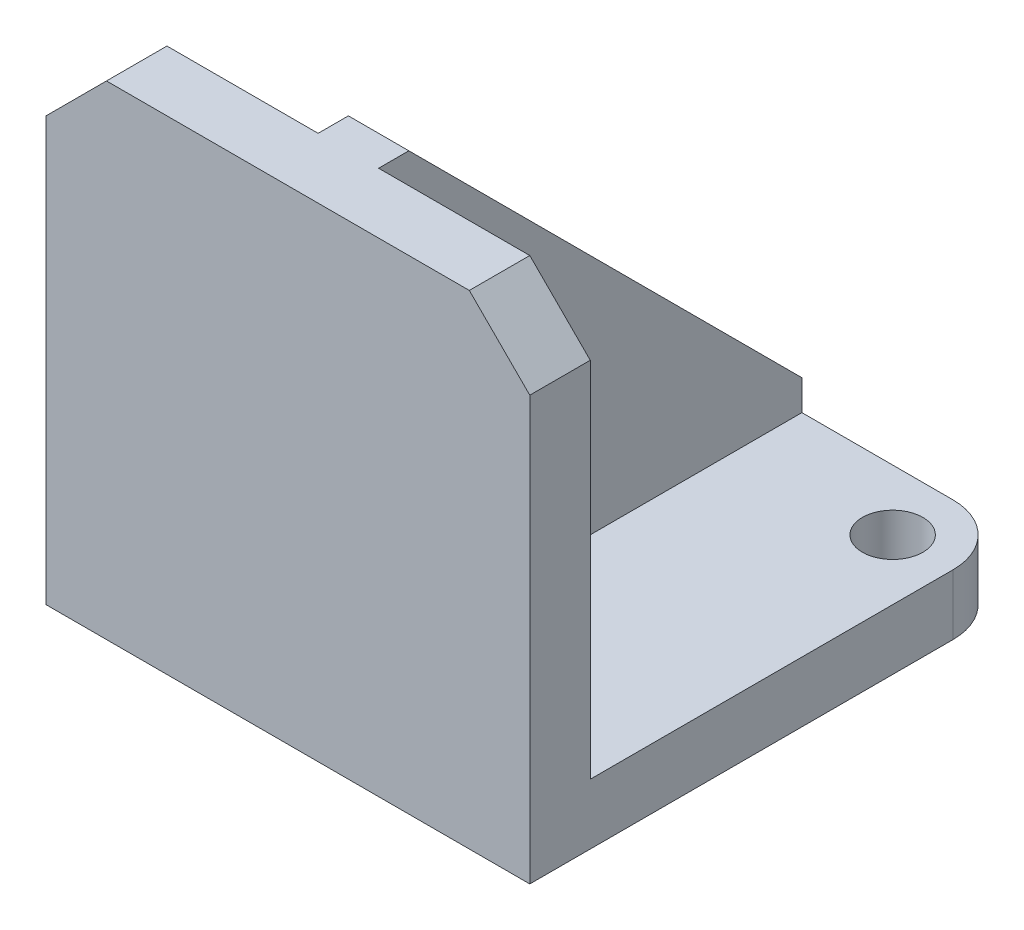
ISO-10303-21;
HEADER;
FILE_DESCRIPTION(('STEP AP214'),'2;1');
FILE_NAME('part.step','',(''),(''),'','','');
FILE_SCHEMA(('AUTOMOTIVE_DESIGN { 1 0 10303 214 1 1 1 1 }'));
ENDSEC;
DATA;
#1=APPLICATION_CONTEXT('core data for automotive mechanical design processes');
#2=APPLICATION_PROTOCOL_DEFINITION('international standard','automotive_design',2000,#1);
#3=PRODUCT_CONTEXT('',#1,'mechanical');
#4=PRODUCT('Part','Part','',(#3));
#5=PRODUCT_RELATED_PRODUCT_CATEGORY('part','',(#4));
#6=PRODUCT_DEFINITION_FORMATION('','',#4);
#7=PRODUCT_DEFINITION_CONTEXT('part definition',#1,'design');
#8=PRODUCT_DEFINITION('design','',#6,#7);
#9=PRODUCT_DEFINITION_SHAPE('','',#8);
#10=(LENGTH_UNIT() NAMED_UNIT(*) SI_UNIT(.MILLI.,.METRE.));
#11=(NAMED_UNIT(*) PLANE_ANGLE_UNIT() SI_UNIT($,.RADIAN.));
#12=(NAMED_UNIT(*) SI_UNIT($,.STERADIAN.) SOLID_ANGLE_UNIT());
#13=UNCERTAINTY_MEASURE_WITH_UNIT(LENGTH_MEASURE(1.E-05),#10,'distance_accuracy_value','');
#14=(GEOMETRIC_REPRESENTATION_CONTEXT(3) GLOBAL_UNCERTAINTY_ASSIGNED_CONTEXT((#13)) GLOBAL_UNIT_ASSIGNED_CONTEXT((#10,
#11,#12)) REPRESENTATION_CONTEXT('',''));
#15=CARTESIAN_POINT('',(0.,0.,0.));
#16=DIRECTION('',(0.,0.,1.));
#17=DIRECTION('',(1.,0.,0.));
#18=AXIS2_PLACEMENT_3D('',#15,#16,#17);
#19=CARTESIAN_POINT('',(40.,10.,-10.));
#20=DIRECTION('',(0.,1.,0.));
#21=DIRECTION('',(0.,0.,1.));
#22=AXIS2_PLACEMENT_3D('',#19,#20,#21);
#23=PLANE('',#22);
#24=CARTESIAN_POINT('',(-30.,10.,-70.));
#25=DIRECTION('',(0.,1.,0.));
#26=DIRECTION('',(0.,0.,1.));
#27=AXIS2_PLACEMENT_3D('',#24,#25,#26);
#28=CIRCLE('',#27,5.);
#29=CARTESIAN_POINT('',(-30.,10.,-65.));
#30=VERTEX_POINT('',#29);
#31=EDGE_CURVE('E337',#30,#30,#28,.T.);
#32=ORIENTED_EDGE('',*,*,#31,.F.);
#33=EDGE_LOOP('',(#32));
#34=FACE_BOUND('',#33,.T.);
#35=DIRECTION('',(-1.,0.,0.));
#36=VECTOR('',#35,1.);
#37=CARTESIAN_POINT('',(40.,10.,-80.));
#38=LINE('',#37,#36);
#39=CARTESIAN_POINT('',(-5.,10.,-80.));
#40=VERTEX_POINT('',#39);
#41=CARTESIAN_POINT('',(-30.,10.,-80.));
#42=VERTEX_POINT('',#41);
#43=EDGE_CURVE('E169',#40,#42,#38,.T.);
#44=ORIENTED_EDGE('',*,*,#43,.T.);
#45=CARTESIAN_POINT('',(-30.,10.,-70.));
#46=DIRECTION('',(0.,1.,0.));
#47=DIRECTION('',(0.,0.,1.));
#48=AXIS2_PLACEMENT_3D('',#45,#46,#47);
#49=CIRCLE('',#48,10.);
#50=CARTESIAN_POINT('',(-40.,10.,-70.));
#51=VERTEX_POINT('',#50);
#52=EDGE_CURVE('E193',#42,#51,#49,.T.);
#53=ORIENTED_EDGE('',*,*,#52,.T.);
#54=DIRECTION('',(0.,0.,-1.));
#55=VECTOR('',#54,1.);
#56=CARTESIAN_POINT('',(-40.,10.,-10.));
#57=LINE('',#56,#55);
#58=CARTESIAN_POINT('',(-40.,10.,-10.));
#59=VERTEX_POINT('',#58);
#60=EDGE_CURVE('E224',#59,#51,#57,.T.);
#61=ORIENTED_EDGE('',*,*,#60,.F.);
#62=DIRECTION('',(-1.,0.,0.));
#63=VECTOR('',#62,1.);
#64=CARTESIAN_POINT('',(40.,10.,-10.));
#65=LINE('',#64,#63);
#66=CARTESIAN_POINT('',(-5.,10.,-10.));
#67=VERTEX_POINT('',#66);
#68=EDGE_CURVE('E170',#67,#59,#65,.T.);
#69=ORIENTED_EDGE('',*,*,#68,.F.);
#70=DIRECTION('',(0.,0.,-1.));
#71=VECTOR('',#70,1.);
#72=CARTESIAN_POINT('',(-5.,10.,-10.));
#73=LINE('',#72,#71);
#74=EDGE_CURVE('E291',#67,#40,#73,.T.);
#75=ORIENTED_EDGE('',*,*,#74,.T.);
#76=EDGE_LOOP('',(#44,#53,#61,#69,#75));
#77=FACE_BOUND('',#76,.T.);
#78=ADVANCED_FACE('F35',(#34,#77),#23,.T.);
#79=CARTESIAN_POINT('',(40.,80.,-10.));
#80=DIRECTION('',(0.,0.,-1.));
#81=DIRECTION('',(-1.,0.,0.));
#82=AXIS2_PLACEMENT_3D('',#79,#80,#81);
#83=PLANE('',#82);
#84=DIRECTION('',(0.,-1.,0.));
#85=VECTOR('',#84,1.);
#86=CARTESIAN_POINT('',(-40.,80.,-10.));
#87=LINE('',#86,#85);
#88=CARTESIAN_POINT('',(-40.,70.,-10.));
#89=VERTEX_POINT('',#88);
#90=EDGE_CURVE('E214',#89,#59,#87,.T.);
#91=ORIENTED_EDGE('',*,*,#90,.F.);
#92=DIRECTION('',(-0.707106781186549,-0.707106781186546,0.));
#93=VECTOR('',#92,1.);
#94=CARTESIAN_POINT('',(5.00000000000018,115.,-10.));
#95=LINE('',#94,#93);
#96=CARTESIAN_POINT('',(-30.,80.,-10.));
#97=VERTEX_POINT('',#96);
#98=EDGE_CURVE('E11',#89,#97,#95,.F.);
#99=ORIENTED_EDGE('',*,*,#98,.T.);
#100=DIRECTION('',(-1.,0.,0.));
#101=VECTOR('',#100,1.);
#102=CARTESIAN_POINT('',(40.,80.,-10.));
#103=LINE('',#102,#101);
#104=CARTESIAN_POINT('',(-5.,80.,-10.));
#105=VERTEX_POINT('',#104);
#106=EDGE_CURVE('E179',#105,#97,#103,.T.);
#107=ORIENTED_EDGE('',*,*,#106,.F.);
#108=DIRECTION('',(0.,-1.,0.));
#109=VECTOR('',#108,1.);
#110=CARTESIAN_POINT('',(-5.,80.,-10.));
#111=LINE('',#110,#109);
#112=EDGE_CURVE('E289',#105,#67,#111,.T.);
#113=ORIENTED_EDGE('',*,*,#112,.T.);
#114=ORIENTED_EDGE('',*,*,#68,.T.);
#115=EDGE_LOOP('',(#91,#99,#107,#113,#114));
#116=FACE_BOUND('',#115,.T.);
#117=ADVANCED_FACE('F218',(#116),#83,.T.);
#118=CARTESIAN_POINT('',(40.,80.,0.));
#119=DIRECTION('',(0.,1.,0.));
#120=DIRECTION('',(0.,0.,1.));
#121=AXIS2_PLACEMENT_3D('',#118,#119,#120);
#122=PLANE('',#121);
#123=DIRECTION('',(-1.,0.,0.));
#124=VECTOR('',#123,1.);
#125=CARTESIAN_POINT('',(40.,80.,0.));
#126=LINE('',#125,#124);
#127=CARTESIAN_POINT('',(30.,80.,0.));
#128=VERTEX_POINT('',#127);
#129=CARTESIAN_POINT('',(-30.,80.,0.));
#130=VERTEX_POINT('',#129);
#131=EDGE_CURVE('E184',#128,#130,#126,.T.);
#132=ORIENTED_EDGE('',*,*,#131,.F.);
#133=DIRECTION('',(0.,0.,-1.));
#134=VECTOR('',#133,1.);
#135=CARTESIAN_POINT('',(30.,80.,-10.));
#136=LINE('',#135,#134);
#137=CARTESIAN_POINT('',(30.,80.,-10.));
#138=VERTEX_POINT('',#137);
#139=EDGE_CURVE('E201',#128,#138,#136,.T.);
#140=ORIENTED_EDGE('',*,*,#139,.T.);
#141=CARTESIAN_POINT('',(5.,80.,-10.));
#142=VERTEX_POINT('',#141);
#143=EDGE_CURVE('E175',#138,#142,#103,.T.);
#144=ORIENTED_EDGE('',*,*,#143,.T.);
#145=DIRECTION('',(0.,0.,1.));
#146=VECTOR('',#145,1.);
#147=CARTESIAN_POINT('',(5.,80.,-10.));
#148=LINE('',#147,#146);
#149=CARTESIAN_POINT('',(5.,80.,-15.));
#150=VERTEX_POINT('',#149);
#151=EDGE_CURVE('E150',#150,#142,#148,.T.);
#152=ORIENTED_EDGE('',*,*,#151,.F.);
#153=DIRECTION('',(-1.,0.,0.));
#154=VECTOR('',#153,1.);
#155=CARTESIAN_POINT('',(5.,80.,-15.));
#156=LINE('',#155,#154);
#157=CARTESIAN_POINT('',(-5.,80.,-15.));
#158=VERTEX_POINT('',#157);
#159=EDGE_CURVE('E230',#150,#158,#156,.T.);
#160=ORIENTED_EDGE('',*,*,#159,.T.);
#161=DIRECTION('',(0.,0.,1.));
#162=VECTOR('',#161,1.);
#163=CARTESIAN_POINT('',(-5.,80.,-10.));
#164=LINE('',#163,#162);
#165=EDGE_CURVE('E154',#158,#105,#164,.T.);
#166=ORIENTED_EDGE('',*,*,#165,.T.);
#167=ORIENTED_EDGE('',*,*,#106,.T.);
#168=DIRECTION('',(0.,0.,1.));
#169=VECTOR('',#168,1.);
#170=CARTESIAN_POINT('',(-30.,80.,0.));
#171=LINE('',#170,#169);
#172=EDGE_CURVE('E199',#97,#130,#171,.T.);
#173=ORIENTED_EDGE('',*,*,#172,.T.);
#174=EDGE_LOOP('',(#132,#140,#144,#152,#160,#166,#167,#173));
#175=FACE_BOUND('',#174,.T.);
#176=ADVANCED_FACE('F272',(#175),#122,.T.);
#177=CARTESIAN_POINT('',(40.,80.,0.));
#178=DIRECTION('',(0.,0.,-1.));
#179=DIRECTION('',(-1.,0.,0.));
#180=AXIS2_PLACEMENT_3D('',#177,#178,#179);
#181=PLANE('',#180);
#182=DIRECTION('',(0.,-1.,0.));
#183=VECTOR('',#182,1.);
#184=CARTESIAN_POINT('',(40.,80.,0.));
#185=LINE('',#184,#183);
#186=CARTESIAN_POINT('',(40.,70.,0.));
#187=VERTEX_POINT('',#186);
#188=CARTESIAN_POINT('',(40.,0.,0.));
#189=VERTEX_POINT('',#188);
#190=EDGE_CURVE('E233',#187,#189,#185,.T.);
#191=ORIENTED_EDGE('',*,*,#190,.F.);
#192=DIRECTION('',(-0.707106781186547,0.707106781186549,0.));
#193=VECTOR('',#192,1.);
#194=CARTESIAN_POINT('',(30.,80.,0.));
#195=LINE('',#194,#193);
#196=EDGE_CURVE('E209',#187,#128,#195,.T.);
#197=ORIENTED_EDGE('',*,*,#196,.T.);
#198=ORIENTED_EDGE('',*,*,#131,.T.);
#199=DIRECTION('',(0.707106781186549,0.707106781186546,0.));
#200=VECTOR('',#199,1.);
#201=CARTESIAN_POINT('',(-40.,70.,0.));
#202=LINE('',#201,#200);
#203=CARTESIAN_POINT('',(-40.,70.,0.));
#204=VERTEX_POINT('',#203);
#205=EDGE_CURVE('E57',#130,#204,#202,.F.);
#206=ORIENTED_EDGE('',*,*,#205,.T.);
#207=DIRECTION('',(0.,-1.,0.));
#208=VECTOR('',#207,1.);
#209=CARTESIAN_POINT('',(-40.,80.,0.));
#210=LINE('',#209,#208);
#211=CARTESIAN_POINT('',(-40.,0.,0.));
#212=VERTEX_POINT('',#211);
#213=EDGE_CURVE('E216',#204,#212,#210,.T.);
#214=ORIENTED_EDGE('',*,*,#213,.T.);
#215=DIRECTION('',(-1.,0.,0.));
#216=VECTOR('',#215,1.);
#217=CARTESIAN_POINT('',(40.,0.,0.));
#218=LINE('',#217,#216);
#219=EDGE_CURVE('E240',#189,#212,#218,.T.);
#220=ORIENTED_EDGE('',*,*,#219,.F.);
#221=EDGE_LOOP('',(#191,#197,#198,#206,#214,#220));
#222=FACE_BOUND('',#221,.T.);
#223=ADVANCED_FACE('F263',(#222),#181,.F.);
#224=CARTESIAN_POINT('',(40.,0.,0.));
#225=DIRECTION('',(0.,1.,0.));
#226=DIRECTION('',(0.,0.,1.));
#227=AXIS2_PLACEMENT_3D('',#224,#225,#226);
#228=PLANE('',#227);
#229=CARTESIAN_POINT('',(30.,0.,-70.));
#230=DIRECTION('',(0.,1.,0.));
#231=DIRECTION('',(0.,0.,1.));
#232=AXIS2_PLACEMENT_3D('',#229,#230,#231);
#233=CIRCLE('',#232,5.);
#234=CARTESIAN_POINT('',(30.,0.,-65.));
#235=VERTEX_POINT('',#234);
#236=EDGE_CURVE('E292',#235,#235,#233,.T.);
#237=ORIENTED_EDGE('',*,*,#236,.T.);
#238=EDGE_LOOP('',(#237));
#239=FACE_BOUND('',#238,.T.);
#240=CARTESIAN_POINT('',(-30.,0.,-70.));
#241=DIRECTION('',(0.,1.,0.));
#242=DIRECTION('',(0.,0.,1.));
#243=AXIS2_PLACEMENT_3D('',#240,#241,#242);
#244=CIRCLE('',#243,5.);
#245=CARTESIAN_POINT('',(-30.,0.,-65.));
#246=VERTEX_POINT('',#245);
#247=EDGE_CURVE('E332',#246,#246,#244,.T.);
#248=ORIENTED_EDGE('',*,*,#247,.T.);
#249=EDGE_LOOP('',(#248));
#250=FACE_BOUND('',#249,.T.);
#251=DIRECTION('',(0.,0.,-1.));
#252=VECTOR('',#251,1.);
#253=CARTESIAN_POINT('',(-40.,0.,0.));
#254=LINE('',#253,#252);
#255=CARTESIAN_POINT('',(-40.,0.,-70.));
#256=VERTEX_POINT('',#255);
#257=EDGE_CURVE('E227',#212,#256,#254,.T.);
#258=ORIENTED_EDGE('',*,*,#257,.T.);
#259=CARTESIAN_POINT('',(-30.,0.,-70.));
#260=DIRECTION('',(0.,1.,0.));
#261=DIRECTION('',(0.,0.,1.));
#262=AXIS2_PLACEMENT_3D('',#259,#260,#261);
#263=CIRCLE('',#262,10.);
#264=CARTESIAN_POINT('',(-30.,0.,-80.));
#265=VERTEX_POINT('',#264);
#266=EDGE_CURVE('E186',#256,#265,#263,.F.);
#267=ORIENTED_EDGE('',*,*,#266,.T.);
#268=DIRECTION('',(-1.,0.,0.));
#269=VECTOR('',#268,1.);
#270=CARTESIAN_POINT('',(40.,0.,-80.));
#271=LINE('',#270,#269);
#272=CARTESIAN_POINT('',(30.,0.,-80.));
#273=VERTEX_POINT('',#272);
#274=EDGE_CURVE('E242',#273,#265,#271,.T.);
#275=ORIENTED_EDGE('',*,*,#274,.F.);
#276=CARTESIAN_POINT('',(30.,0.,-70.));
#277=DIRECTION('',(0.,1.,0.));
#278=DIRECTION('',(0.,0.,1.));
#279=AXIS2_PLACEMENT_3D('',#276,#277,#278);
#280=CIRCLE('',#279,10.);
#281=CARTESIAN_POINT('',(40.,0.,-70.));
#282=VERTEX_POINT('',#281);
#283=EDGE_CURVE('E183',#273,#282,#280,.F.);
#284=ORIENTED_EDGE('',*,*,#283,.T.);
#285=DIRECTION('',(0.,0.,-1.));
#286=VECTOR('',#285,1.);
#287=CARTESIAN_POINT('',(40.,0.,0.));
#288=LINE('',#287,#286);
#289=EDGE_CURVE('E261',#189,#282,#288,.T.);
#290=ORIENTED_EDGE('',*,*,#289,.F.);
#291=ORIENTED_EDGE('',*,*,#219,.T.);
#292=EDGE_LOOP('',(#258,#267,#275,#284,#290,#291));
#293=FACE_BOUND('',#292,.T.);
#294=ADVANCED_FACE('F257',(#239,#250,#293),#228,.F.);
#295=CARTESIAN_POINT('',(40.,10.,-80.));
#296=DIRECTION('',(0.,0.,-1.));
#297=DIRECTION('',(-1.,0.,0.));
#298=AXIS2_PLACEMENT_3D('',#295,#296,#297);
#299=PLANE('',#298);
#300=ORIENTED_EDGE('',*,*,#274,.T.);
#301=DIRECTION('',(0.,-1.,0.));
#302=VECTOR('',#301,1.);
#303=CARTESIAN_POINT('',(-30.,10.,-80.));
#304=LINE('',#303,#302);
#305=EDGE_CURVE('E191',#265,#42,#304,.F.);
#306=ORIENTED_EDGE('',*,*,#305,.T.);
#307=ORIENTED_EDGE('',*,*,#43,.F.);
#308=DIRECTION('',(0.,1.,0.));
#309=VECTOR('',#308,1.);
#310=CARTESIAN_POINT('',(-5.,10.,-80.));
#311=LINE('',#310,#309);
#312=CARTESIAN_POINT('',(-5.,15.,-80.));
#313=VERTEX_POINT('',#312);
#314=EDGE_CURVE('E294',#40,#313,#311,.T.);
#315=ORIENTED_EDGE('',*,*,#314,.T.);
#316=DIRECTION('',(-1.,0.,0.));
#317=VECTOR('',#316,1.);
#318=CARTESIAN_POINT('',(5.,15.,-80.));
#319=LINE('',#318,#317);
#320=CARTESIAN_POINT('',(5.,15.,-80.));
#321=VERTEX_POINT('',#320);
#322=EDGE_CURVE('E225',#321,#313,#319,.T.);
#323=ORIENTED_EDGE('',*,*,#322,.F.);
#324=DIRECTION('',(0.,1.,0.));
#325=VECTOR('',#324,1.);
#326=CARTESIAN_POINT('',(5.,10.,-80.));
#327=LINE('',#326,#325);
#328=CARTESIAN_POINT('',(5.,10.,-80.));
#329=VERTEX_POINT('',#328);
#330=EDGE_CURVE('E164',#329,#321,#327,.T.);
#331=ORIENTED_EDGE('',*,*,#330,.F.);
#332=CARTESIAN_POINT('',(30.,10.,-80.));
#333=VERTEX_POINT('',#332);
#334=EDGE_CURVE('E163',#333,#329,#38,.T.);
#335=ORIENTED_EDGE('',*,*,#334,.F.);
#336=DIRECTION('',(0.,-1.,0.));
#337=VECTOR('',#336,1.);
#338=CARTESIAN_POINT('',(30.,0.,-80.));
#339=LINE('',#338,#337);
#340=EDGE_CURVE('E188',#333,#273,#339,.T.);
#341=ORIENTED_EDGE('',*,*,#340,.T.);
#342=EDGE_LOOP('',(#300,#306,#307,#315,#323,#331,#335,#341));
#343=FACE_BOUND('',#342,.T.);
#344=ADVANCED_FACE('F247',(#343),#299,.T.);
#345=CARTESIAN_POINT('',(30.,10.,-70.));
#346=DIRECTION('',(0.,1.,0.));
#347=DIRECTION('',(0.,0.,1.));
#348=AXIS2_PLACEMENT_3D('',#345,#346,#347);
#349=CIRCLE('',#348,5.);
#350=CARTESIAN_POINT('',(30.,10.,-65.));
#351=VERTEX_POINT('',#350);
#352=EDGE_CURVE('E330',#351,#351,#349,.T.);
#353=ORIENTED_EDGE('',*,*,#352,.F.);
#354=EDGE_LOOP('',(#353));
#355=FACE_BOUND('',#354,.T.);
#356=DIRECTION('',(0.,0.,-1.));
#357=VECTOR('',#356,1.);
#358=CARTESIAN_POINT('',(40.,10.,-10.));
#359=LINE('',#358,#357);
#360=CARTESIAN_POINT('',(40.,10.,-10.));
#361=VERTEX_POINT('',#360);
#362=CARTESIAN_POINT('',(40.,10.,-70.));
#363=VERTEX_POINT('',#362);
#364=EDGE_CURVE('E274',#361,#363,#359,.T.);
#365=ORIENTED_EDGE('',*,*,#364,.T.);
#366=CARTESIAN_POINT('',(30.,10.,-70.));
#367=DIRECTION('',(0.,1.,0.));
#368=DIRECTION('',(0.,0.,1.));
#369=AXIS2_PLACEMENT_3D('',#366,#367,#368);
#370=CIRCLE('',#369,10.);
#371=EDGE_CURVE('E197',#363,#333,#370,.T.);
#372=ORIENTED_EDGE('',*,*,#371,.T.);
#373=ORIENTED_EDGE('',*,*,#334,.T.);
#374=DIRECTION('',(0.,0.,-1.));
#375=VECTOR('',#374,1.);
#376=CARTESIAN_POINT('',(5.,10.,-10.));
#377=LINE('',#376,#375);
#378=CARTESIAN_POINT('',(5.,10.,-10.));
#379=VERTEX_POINT('',#378);
#380=EDGE_CURVE('E147',#379,#329,#377,.T.);
#381=ORIENTED_EDGE('',*,*,#380,.F.);
#382=EDGE_CURVE('E160',#361,#379,#65,.T.);
#383=ORIENTED_EDGE('',*,*,#382,.F.);
#384=EDGE_LOOP('',(#365,#372,#373,#381,#383));
#385=FACE_BOUND('',#384,.T.);
#386=ADVANCED_FACE('F159',(#355,#385),#23,.T.);
#387=ORIENTED_EDGE('',*,*,#143,.F.);
#388=DIRECTION('',(0.707106781186547,-0.707106781186549,0.));
#389=VECTOR('',#388,1.);
#390=CARTESIAN_POINT('',(35.,75.,-10.));
#391=LINE('',#390,#389);
#392=CARTESIAN_POINT('',(40.,70.,-10.));
#393=VERTEX_POINT('',#392);
#394=EDGE_CURVE('E204',#138,#393,#391,.T.);
#395=ORIENTED_EDGE('',*,*,#394,.T.);
#396=DIRECTION('',(0.,-1.,0.));
#397=VECTOR('',#396,1.);
#398=CARTESIAN_POINT('',(40.,80.,-10.));
#399=LINE('',#398,#397);
#400=EDGE_CURVE('E168',#393,#361,#399,.T.);
#401=ORIENTED_EDGE('',*,*,#400,.T.);
#402=ORIENTED_EDGE('',*,*,#382,.T.);
#403=DIRECTION('',(0.,-1.,0.));
#404=VECTOR('',#403,1.);
#405=CARTESIAN_POINT('',(5.,80.,-10.));
#406=LINE('',#405,#404);
#407=EDGE_CURVE('E144',#142,#379,#406,.T.);
#408=ORIENTED_EDGE('',*,*,#407,.F.);
#409=EDGE_LOOP('',(#387,#395,#401,#402,#408));
#410=FACE_BOUND('',#409,.T.);
#411=ADVANCED_FACE('F166',(#410),#83,.T.);
#412=CARTESIAN_POINT('',(40.,0.,0.));
#413=DIRECTION('',(-1.,0.,0.));
#414=DIRECTION('',(0.,0.,1.));
#415=AXIS2_PLACEMENT_3D('',#412,#413,#414);
#416=PLANE('',#415);
#417=ORIENTED_EDGE('',*,*,#400,.F.);
#418=DIRECTION('',(0.,0.,1.));
#419=VECTOR('',#418,1.);
#420=CARTESIAN_POINT('',(40.,70.,0.));
#421=LINE('',#420,#419);
#422=EDGE_CURVE('E206',#393,#187,#421,.T.);
#423=ORIENTED_EDGE('',*,*,#422,.T.);
#424=ORIENTED_EDGE('',*,*,#190,.T.);
#425=ORIENTED_EDGE('',*,*,#289,.T.);
#426=DIRECTION('',(0.,-1.,0.));
#427=VECTOR('',#426,1.);
#428=CARTESIAN_POINT('',(40.,10.,-70.));
#429=LINE('',#428,#427);
#430=EDGE_CURVE('E195',#282,#363,#429,.F.);
#431=ORIENTED_EDGE('',*,*,#430,.T.);
#432=ORIENTED_EDGE('',*,*,#364,.F.);
#433=EDGE_LOOP('',(#417,#423,#424,#425,#431,#432));
#434=FACE_BOUND('',#433,.T.);
#435=ADVANCED_FACE('F273',(#434),#416,.F.);
#436=CARTESIAN_POINT('',(-40.,0.,0.));
#437=DIRECTION('',(-1.,0.,0.));
#438=DIRECTION('',(0.,0.,1.));
#439=AXIS2_PLACEMENT_3D('',#436,#437,#438);
#440=PLANE('',#439);
#441=ORIENTED_EDGE('',*,*,#213,.F.);
#442=DIRECTION('',(0.,0.,-1.));
#443=VECTOR('',#442,1.);
#444=CARTESIAN_POINT('',(-40.,70.,0.));
#445=LINE('',#444,#443);
#446=EDGE_CURVE('E44',#204,#89,#445,.T.);
#447=ORIENTED_EDGE('',*,*,#446,.T.);
#448=ORIENTED_EDGE('',*,*,#90,.T.);
#449=ORIENTED_EDGE('',*,*,#60,.T.);
#450=DIRECTION('',(0.,-1.,0.));
#451=VECTOR('',#450,1.);
#452=CARTESIAN_POINT('',(-40.,0.,-70.));
#453=LINE('',#452,#451);
#454=EDGE_CURVE('E180',#51,#256,#453,.T.);
#455=ORIENTED_EDGE('',*,*,#454,.T.);
#456=ORIENTED_EDGE('',*,*,#257,.F.);
#457=EDGE_LOOP('',(#441,#447,#448,#449,#455,#456));
#458=FACE_BOUND('',#457,.T.);
#459=ADVANCED_FACE('F212',(#458),#440,.T.);
#460=CARTESIAN_POINT('',(5.,80.,-15.));
#461=DIRECTION('',(0.,-0.707106781186548,0.707106781186548));
#462=DIRECTION('',(0.,-0.707106781186548,-0.707106781186548));
#463=AXIS2_PLACEMENT_3D('',#460,#461,#462);
#464=PLANE('',#463);
#465=DIRECTION('',(0.,0.707106781186547,0.707106781186547));
#466=VECTOR('',#465,1.);
#467=CARTESIAN_POINT('',(-5.,80.,-15.));
#468=LINE('',#467,#466);
#469=EDGE_CURVE('E296',#313,#158,#468,.T.);
#470=ORIENTED_EDGE('',*,*,#469,.T.);
#471=ORIENTED_EDGE('',*,*,#159,.F.);
#472=DIRECTION('',(0.,0.707106781186547,0.707106781186547));
#473=VECTOR('',#472,1.);
#474=CARTESIAN_POINT('',(5.,80.,-15.));
#475=LINE('',#474,#473);
#476=EDGE_CURVE('E284',#321,#150,#475,.T.);
#477=ORIENTED_EDGE('',*,*,#476,.F.);
#478=ORIENTED_EDGE('',*,*,#322,.T.);
#479=EDGE_LOOP('',(#470,#471,#477,#478));
#480=FACE_BOUND('',#479,.T.);
#481=ADVANCED_FACE('F355',(#480),#464,.F.);
#482=CARTESIAN_POINT('',(5.,0.,0.));
#483=DIRECTION('',(1.,0.,0.));
#484=DIRECTION('',(0.,0.,-1.));
#485=AXIS2_PLACEMENT_3D('',#482,#483,#484);
#486=PLANE('',#485);
#487=ORIENTED_EDGE('',*,*,#407,.T.);
#488=ORIENTED_EDGE('',*,*,#380,.T.);
#489=ORIENTED_EDGE('',*,*,#330,.T.);
#490=ORIENTED_EDGE('',*,*,#476,.T.);
#491=ORIENTED_EDGE('',*,*,#151,.T.);
#492=EDGE_LOOP('',(#487,#488,#489,#490,#491));
#493=FACE_BOUND('',#492,.T.);
#494=ADVANCED_FACE('F146',(#493),#486,.T.);
#495=CARTESIAN_POINT('',(-5.,0.,0.));
#496=DIRECTION('',(1.,0.,0.));
#497=DIRECTION('',(0.,0.,-1.));
#498=AXIS2_PLACEMENT_3D('',#495,#496,#497);
#499=PLANE('',#498);
#500=ORIENTED_EDGE('',*,*,#112,.F.);
#501=ORIENTED_EDGE('',*,*,#165,.F.);
#502=ORIENTED_EDGE('',*,*,#469,.F.);
#503=ORIENTED_EDGE('',*,*,#314,.F.);
#504=ORIENTED_EDGE('',*,*,#74,.F.);
#505=EDGE_LOOP('',(#500,#501,#502,#503,#504));
#506=FACE_BOUND('',#505,.T.);
#507=ADVANCED_FACE('F305',(#506),#499,.F.);
#508=CARTESIAN_POINT('',(-30.,0.,-70.));
#509=DIRECTION('',(0.,-1.,0.));
#510=DIRECTION('',(0.,0.,-1.));
#511=AXIS2_PLACEMENT_3D('',#508,#509,#510);
#512=CYLINDRICAL_SURFACE('',#511,10.);
#513=ORIENTED_EDGE('',*,*,#52,.F.);
#514=ORIENTED_EDGE('',*,*,#305,.F.);
#515=ORIENTED_EDGE('',*,*,#266,.F.);
#516=ORIENTED_EDGE('',*,*,#454,.F.);
#517=EDGE_LOOP('',(#513,#514,#515,#516));
#518=FACE_BOUND('',#517,.T.);
#519=ADVANCED_FACE('F253',(#518),#512,.T.);
#520=CARTESIAN_POINT('',(30.,10.,-70.));
#521=DIRECTION('',(0.,1.,0.));
#522=DIRECTION('',(0.,0.,1.));
#523=AXIS2_PLACEMENT_3D('',#520,#521,#522);
#524=CYLINDRICAL_SURFACE('',#523,10.);
#525=ORIENTED_EDGE('',*,*,#371,.F.);
#526=ORIENTED_EDGE('',*,*,#430,.F.);
#527=ORIENTED_EDGE('',*,*,#283,.F.);
#528=ORIENTED_EDGE('',*,*,#340,.F.);
#529=EDGE_LOOP('',(#525,#526,#527,#528));
#530=FACE_BOUND('',#529,.T.);
#531=ADVANCED_FACE('F281',(#530),#524,.T.);
#532=CARTESIAN_POINT('',(30.,0.,-70.));
#533=DIRECTION('',(0.,1.,0.));
#534=DIRECTION('',(0.,0.,1.));
#535=AXIS2_PLACEMENT_3D('',#532,#533,#534);
#536=CYLINDRICAL_SURFACE('',#535,5.);
#537=ORIENTED_EDGE('',*,*,#236,.F.);
#538=EDGE_LOOP('',(#537));
#539=FACE_BOUND('',#538,.T.);
#540=ORIENTED_EDGE('',*,*,#352,.T.);
#541=EDGE_LOOP('',(#540));
#542=FACE_BOUND('',#541,.T.);
#543=ADVANCED_FACE('F343',(#539,#542),#536,.F.);
#544=CARTESIAN_POINT('',(-30.,0.,-70.));
#545=DIRECTION('',(0.,1.,0.));
#546=DIRECTION('',(0.,0.,1.));
#547=AXIS2_PLACEMENT_3D('',#544,#545,#546);
#548=CYLINDRICAL_SURFACE('',#547,5.);
#549=ORIENTED_EDGE('',*,*,#247,.F.);
#550=EDGE_LOOP('',(#549));
#551=FACE_BOUND('',#550,.T.);
#552=ORIENTED_EDGE('',*,*,#31,.T.);
#553=EDGE_LOOP('',(#552));
#554=FACE_BOUND('',#553,.T.);
#555=ADVANCED_FACE('F310',(#551,#554),#548,.F.);
#556=CARTESIAN_POINT('',(30.,80.,0.));
#557=DIRECTION('',(0.707106781186548,0.707106781186546,0.));
#558=DIRECTION('',(0.,0.,1.));
#559=AXIS2_PLACEMENT_3D('',#556,#557,#558);
#560=PLANE('',#559);
#561=ORIENTED_EDGE('',*,*,#196,.F.);
#562=ORIENTED_EDGE('',*,*,#422,.F.);
#563=ORIENTED_EDGE('',*,*,#394,.F.);
#564=ORIENTED_EDGE('',*,*,#139,.F.);
#565=EDGE_LOOP('',(#561,#562,#563,#564));
#566=FACE_BOUND('',#565,.T.);
#567=ADVANCED_FACE('F270',(#566),#560,.T.);
#568=CARTESIAN_POINT('',(-40.,70.,0.));
#569=DIRECTION('',(0.707106781186546,-0.707106781186549,0.));
#570=DIRECTION('',(0.,0.,-1.));
#571=AXIS2_PLACEMENT_3D('',#568,#569,#570);
#572=PLANE('',#571);
#573=ORIENTED_EDGE('',*,*,#205,.F.);
#574=ORIENTED_EDGE('',*,*,#172,.F.);
#575=ORIENTED_EDGE('',*,*,#98,.F.);
#576=ORIENTED_EDGE('',*,*,#446,.F.);
#577=EDGE_LOOP('',(#573,#574,#575,#576));
#578=FACE_BOUND('',#577,.T.);
#579=ADVANCED_FACE('F38',(#578),#572,.F.);
#580=CLOSED_SHELL('',(#78,#117,#176,#223,#294,#344,#386,#411,#435,#459,#481,#494,#507,#519,#531,
#543,#555,#567,#579));
#581=MANIFOLD_SOLID_BREP('B2',#580);
#582=ADVANCED_BREP_SHAPE_REPRESENTATION('',(#18,#581),#14);
#583=SHAPE_DEFINITION_REPRESENTATION(#9,#582);
ENDSEC;
END-ISO-10303-21;
